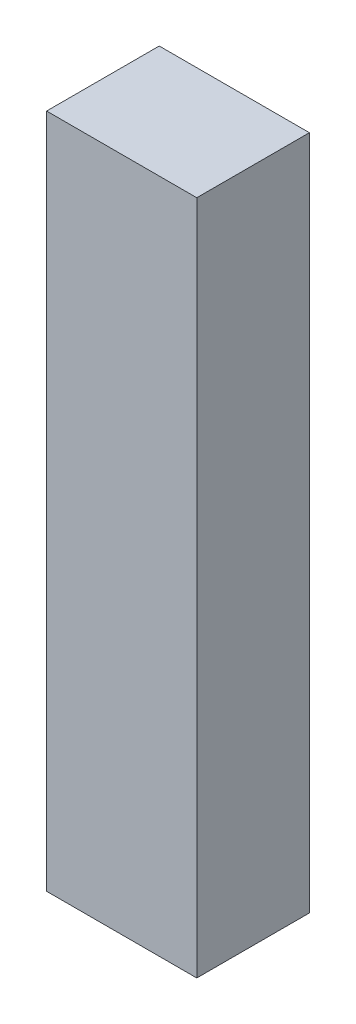
ISO-10303-21;
HEADER;
FILE_DESCRIPTION(('STEP AP214'),'2;1');
FILE_NAME('part.step','',(''),(''),'','','');
FILE_SCHEMA(('AUTOMOTIVE_DESIGN { 1 0 10303 214 1 1 1 1 }'));
ENDSEC;
DATA;
#1=APPLICATION_CONTEXT('core data for automotive mechanical design processes');
#2=APPLICATION_PROTOCOL_DEFINITION('international standard','automotive_design',2000,#1);
#3=PRODUCT_CONTEXT('',#1,'mechanical');
#4=PRODUCT('Part','Part','',(#3));
#5=PRODUCT_RELATED_PRODUCT_CATEGORY('part','',(#4));
#6=PRODUCT_DEFINITION_FORMATION('','',#4);
#7=PRODUCT_DEFINITION_CONTEXT('part definition',#1,'design');
#8=PRODUCT_DEFINITION('design','',#6,#7);
#9=PRODUCT_DEFINITION_SHAPE('','',#8);
#10=(LENGTH_UNIT() NAMED_UNIT(*) SI_UNIT(.MILLI.,.METRE.));
#11=(NAMED_UNIT(*) PLANE_ANGLE_UNIT() SI_UNIT($,.RADIAN.));
#12=(NAMED_UNIT(*) SI_UNIT($,.STERADIAN.) SOLID_ANGLE_UNIT());
#13=UNCERTAINTY_MEASURE_WITH_UNIT(LENGTH_MEASURE(1.E-05),#10,'distance_accuracy_value','');
#14=(GEOMETRIC_REPRESENTATION_CONTEXT(3) GLOBAL_UNCERTAINTY_ASSIGNED_CONTEXT((#13)) GLOBAL_UNIT_ASSIGNED_CONTEXT((#10,
#11,#12)) REPRESENTATION_CONTEXT('',''));
#15=CARTESIAN_POINT('',(0.,0.,0.));
#16=DIRECTION('',(0.,0.,1.));
#17=DIRECTION('',(1.,0.,0.));
#18=AXIS2_PLACEMENT_3D('',#15,#16,#17);
#19=CARTESIAN_POINT('',(-50.,450.,37.5));
#20=DIRECTION('',(1.,0.,0.));
#21=DIRECTION('',(0.,0.,-1.));
#22=AXIS2_PLACEMENT_3D('',#19,#20,#21);
#23=PLANE('',#22);
#24=DIRECTION('',(0.,0.,1.));
#25=VECTOR('',#24,1.);
#26=CARTESIAN_POINT('',(-50.,0.,37.5));
#27=LINE('',#26,#25);
#28=CARTESIAN_POINT('',(-50.,0.,-37.5));
#29=VERTEX_POINT('',#28);
#30=CARTESIAN_POINT('',(-50.,0.,37.5));
#31=VERTEX_POINT('',#30);
#32=EDGE_CURVE('E99',#29,#31,#27,.T.);
#33=ORIENTED_EDGE('',*,*,#32,.T.);
#34=DIRECTION('',(0.,-1.,0.));
#35=VECTOR('',#34,1.);
#36=CARTESIAN_POINT('',(-50.,450.,37.5));
#37=LINE('',#36,#35);
#38=CARTESIAN_POINT('',(-50.,450.,37.5));
#39=VERTEX_POINT('',#38);
#40=EDGE_CURVE('E11',#39,#31,#37,.T.);
#41=ORIENTED_EDGE('',*,*,#40,.F.);
#42=DIRECTION('',(0.,0.,1.));
#43=VECTOR('',#42,1.);
#44=CARTESIAN_POINT('',(-50.,450.,37.5));
#45=LINE('',#44,#43);
#46=CARTESIAN_POINT('',(-50.,450.,-37.5));
#47=VERTEX_POINT('',#46);
#48=EDGE_CURVE('E87',#47,#39,#45,.T.);
#49=ORIENTED_EDGE('',*,*,#48,.F.);
#50=DIRECTION('',(0.,-1.,0.));
#51=VECTOR('',#50,1.);
#52=CARTESIAN_POINT('',(-50.,450.,-37.5));
#53=LINE('',#52,#51);
#54=EDGE_CURVE('E95',#47,#29,#53,.T.);
#55=ORIENTED_EDGE('',*,*,#54,.T.);
#56=EDGE_LOOP('',(#33,#41,#49,#55));
#57=FACE_BOUND('',#56,.T.);
#58=ADVANCED_FACE('F36',(#57),#23,.F.);
#59=CARTESIAN_POINT('',(50.,450.,37.5));
#60=DIRECTION('',(0.,0.,-1.));
#61=DIRECTION('',(-1.,0.,0.));
#62=AXIS2_PLACEMENT_3D('',#59,#60,#61);
#63=PLANE('',#62);
#64=DIRECTION('',(1.,0.,0.));
#65=VECTOR('',#64,1.);
#66=CARTESIAN_POINT('',(50.,0.,37.5));
#67=LINE('',#66,#65);
#68=CARTESIAN_POINT('',(50.,0.,37.5));
#69=VERTEX_POINT('',#68);
#70=EDGE_CURVE('E91',#31,#69,#67,.T.);
#71=ORIENTED_EDGE('',*,*,#70,.T.);
#72=DIRECTION('',(0.,-1.,0.));
#73=VECTOR('',#72,1.);
#74=CARTESIAN_POINT('',(50.,450.,37.5));
#75=LINE('',#74,#73);
#76=CARTESIAN_POINT('',(50.,450.,37.5));
#77=VERTEX_POINT('',#76);
#78=EDGE_CURVE('E44',#77,#69,#75,.T.);
#79=ORIENTED_EDGE('',*,*,#78,.F.);
#80=DIRECTION('',(1.,0.,0.));
#81=VECTOR('',#80,1.);
#82=CARTESIAN_POINT('',(50.,450.,37.5));
#83=LINE('',#82,#81);
#84=EDGE_CURVE('E82',#39,#77,#83,.T.);
#85=ORIENTED_EDGE('',*,*,#84,.F.);
#86=ORIENTED_EDGE('',*,*,#40,.T.);
#87=EDGE_LOOP('',(#71,#79,#85,#86));
#88=FACE_BOUND('',#87,.T.);
#89=ADVANCED_FACE('F90',(#88),#63,.F.);
#90=CARTESIAN_POINT('',(50.,450.,37.5));
#91=DIRECTION('',(-1.,0.,0.));
#92=DIRECTION('',(0.,0.,1.));
#93=AXIS2_PLACEMENT_3D('',#90,#91,#92);
#94=PLANE('',#93);
#95=DIRECTION('',(0.,0.,-1.));
#96=VECTOR('',#95,1.);
#97=CARTESIAN_POINT('',(50.,0.,37.5));
#98=LINE('',#97,#96);
#99=CARTESIAN_POINT('',(50.,0.,-37.5));
#100=VERTEX_POINT('',#99);
#101=EDGE_CURVE('E69',#69,#100,#98,.T.);
#102=ORIENTED_EDGE('',*,*,#101,.T.);
#103=DIRECTION('',(0.,-1.,0.));
#104=VECTOR('',#103,1.);
#105=CARTESIAN_POINT('',(50.,450.,-37.5));
#106=LINE('',#105,#104);
#107=CARTESIAN_POINT('',(50.,450.,-37.5));
#108=VERTEX_POINT('',#107);
#109=EDGE_CURVE('E92',#108,#100,#106,.T.);
#110=ORIENTED_EDGE('',*,*,#109,.F.);
#111=DIRECTION('',(0.,0.,-1.));
#112=VECTOR('',#111,1.);
#113=CARTESIAN_POINT('',(50.,450.,37.5));
#114=LINE('',#113,#112);
#115=EDGE_CURVE('E85',#77,#108,#114,.T.);
#116=ORIENTED_EDGE('',*,*,#115,.F.);
#117=ORIENTED_EDGE('',*,*,#78,.T.);
#118=EDGE_LOOP('',(#102,#110,#116,#117));
#119=FACE_BOUND('',#118,.T.);
#120=ADVANCED_FACE('F93',(#119),#94,.F.);
#121=CARTESIAN_POINT('',(50.,450.,-37.5));
#122=DIRECTION('',(0.,0.,1.));
#123=DIRECTION('',(1.,0.,0.));
#124=AXIS2_PLACEMENT_3D('',#121,#122,#123);
#125=PLANE('',#124);
#126=DIRECTION('',(-1.,0.,0.));
#127=VECTOR('',#126,1.);
#128=CARTESIAN_POINT('',(50.,0.,-37.5));
#129=LINE('',#128,#127);
#130=EDGE_CURVE('E75',#100,#29,#129,.T.);
#131=ORIENTED_EDGE('',*,*,#130,.T.);
#132=ORIENTED_EDGE('',*,*,#54,.F.);
#133=DIRECTION('',(-1.,0.,0.));
#134=VECTOR('',#133,1.);
#135=CARTESIAN_POINT('',(50.,450.,-37.5));
#136=LINE('',#135,#134);
#137=EDGE_CURVE('E52',#108,#47,#136,.T.);
#138=ORIENTED_EDGE('',*,*,#137,.F.);
#139=ORIENTED_EDGE('',*,*,#109,.T.);
#140=EDGE_LOOP('',(#131,#132,#138,#139));
#141=FACE_BOUND('',#140,.T.);
#142=ADVANCED_FACE('F106',(#141),#125,.F.);
#143=CARTESIAN_POINT('',(0.,450.,0.));
#144=DIRECTION('',(0.,1.,0.));
#145=DIRECTION('',(0.,0.,1.));
#146=AXIS2_PLACEMENT_3D('',#143,#144,#145);
#147=PLANE('',#146);
#148=ORIENTED_EDGE('',*,*,#48,.T.);
#149=ORIENTED_EDGE('',*,*,#84,.T.);
#150=ORIENTED_EDGE('',*,*,#115,.T.);
#151=ORIENTED_EDGE('',*,*,#137,.T.);
#152=EDGE_LOOP('',(#148,#149,#150,#151));
#153=FACE_BOUND('',#152,.T.);
#154=ADVANCED_FACE('F83',(#153),#147,.T.);
#155=CARTESIAN_POINT('',(0.,0.,0.));
#156=DIRECTION('',(0.,1.,0.));
#157=DIRECTION('',(0.,0.,1.));
#158=AXIS2_PLACEMENT_3D('',#155,#156,#157);
#159=PLANE('',#158);
#160=ORIENTED_EDGE('',*,*,#32,.F.);
#161=ORIENTED_EDGE('',*,*,#130,.F.);
#162=ORIENTED_EDGE('',*,*,#101,.F.);
#163=ORIENTED_EDGE('',*,*,#70,.F.);
#164=EDGE_LOOP('',(#160,#161,#162,#163));
#165=FACE_BOUND('',#164,.T.);
#166=ADVANCED_FACE('F109',(#165),#159,.F.);
#167=CLOSED_SHELL('',(#58,#89,#120,#142,#154,#166));
#168=MANIFOLD_SOLID_BREP('B2',#167);
#169=ADVANCED_BREP_SHAPE_REPRESENTATION('',(#18,#168),#14);
#170=SHAPE_DEFINITION_REPRESENTATION(#9,#169);
ENDSEC;
END-ISO-10303-21;
